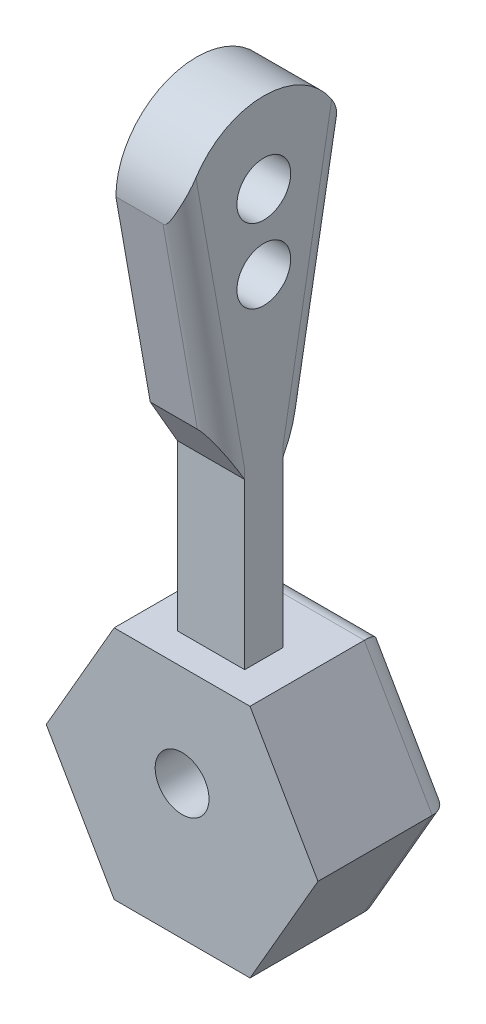
ISO-10303-21;
HEADER;
FILE_DESCRIPTION(('STEP AP214'),'2;1');
FILE_NAME('part.step','',(''),(''),'','','');
FILE_SCHEMA(('AUTOMOTIVE_DESIGN { 1 0 10303 214 1 1 1 1 }'));
ENDSEC;
DATA;
#1=APPLICATION_CONTEXT('core data for automotive mechanical design processes');
#2=APPLICATION_PROTOCOL_DEFINITION('international standard','automotive_design',2000,#1);
#3=PRODUCT_CONTEXT('',#1,'mechanical');
#4=PRODUCT('Part','Part','',(#3));
#5=PRODUCT_RELATED_PRODUCT_CATEGORY('part','',(#4));
#6=PRODUCT_DEFINITION_FORMATION('','',#4);
#7=PRODUCT_DEFINITION_CONTEXT('part definition',#1,'design');
#8=PRODUCT_DEFINITION('design','',#6,#7);
#9=PRODUCT_DEFINITION_SHAPE('','',#8);
#10=(LENGTH_UNIT() NAMED_UNIT(*) SI_UNIT(.MILLI.,.METRE.));
#11=(NAMED_UNIT(*) PLANE_ANGLE_UNIT() SI_UNIT($,.RADIAN.));
#12=(NAMED_UNIT(*) SI_UNIT($,.STERADIAN.) SOLID_ANGLE_UNIT());
#13=UNCERTAINTY_MEASURE_WITH_UNIT(LENGTH_MEASURE(1.E-05),#10,'distance_accuracy_value','');
#14=(GEOMETRIC_REPRESENTATION_CONTEXT(3) GLOBAL_UNCERTAINTY_ASSIGNED_CONTEXT((#13)) GLOBAL_UNIT_ASSIGNED_CONTEXT((#10,
#11,#12)) REPRESENTATION_CONTEXT('',''));
#15=CARTESIAN_POINT('',(0.,0.,0.));
#16=DIRECTION('',(0.,0.,1.));
#17=DIRECTION('',(1.,0.,0.));
#18=AXIS2_PLACEMENT_3D('',#15,#16,#17);
#19=CARTESIAN_POINT('',(-20.2072594216369,0.,-20.));
#20=DIRECTION('',(-0.866025403784439,-0.5,0.));
#21=DIRECTION('',(0.5,-0.866025403784439,0.));
#22=AXIS2_PLACEMENT_3D('',#19,#20,#21);
#23=PLANE('',#22);
#24=DIRECTION('',(0.,0.,1.));
#25=VECTOR('',#24,1.);
#26=CARTESIAN_POINT('',(-20.2072594216369,0.,-20.));
#27=LINE('',#26,#25);
#28=CARTESIAN_POINT('',(-20.2072594216369,0.,-17.));
#29=VERTEX_POINT('',#28);
#30=CARTESIAN_POINT('',(-20.2072594216369,0.,0.));
#31=VERTEX_POINT('',#30);
#32=EDGE_CURVE('E263',#29,#31,#27,.T.);
#33=ORIENTED_EDGE('',*,*,#32,.F.);
#34=DIRECTION('',(0.5,-0.866025403784439,0.));
#35=VECTOR('',#34,1.);
#36=CARTESIAN_POINT('',(-10.1036297108184,-17.5,-17.));
#37=LINE('',#36,#35);
#38=CARTESIAN_POINT('',(-10.1036297108185,-17.5,-17.));
#39=VERTEX_POINT('',#38);
#40=EDGE_CURVE('E290',#29,#39,#37,.T.);
#41=ORIENTED_EDGE('',*,*,#40,.T.);
#42=DIRECTION('',(0.,0.,1.));
#43=VECTOR('',#42,1.);
#44=CARTESIAN_POINT('',(-10.1036297108185,-17.5,-20.));
#45=LINE('',#44,#43);
#46=CARTESIAN_POINT('',(-10.1036297108185,-17.5,0.));
#47=VERTEX_POINT('',#46);
#48=EDGE_CURVE('E262',#39,#47,#45,.T.);
#49=ORIENTED_EDGE('',*,*,#48,.T.);
#50=DIRECTION('',(0.5,-0.866025403784439,0.));
#51=VECTOR('',#50,1.);
#52=CARTESIAN_POINT('',(-20.2072594216369,0.,0.));
#53=LINE('',#52,#51);
#54=EDGE_CURVE('E243',#31,#47,#53,.T.);
#55=ORIENTED_EDGE('',*,*,#54,.F.);
#56=EDGE_LOOP('',(#33,#41,#49,#55));
#57=FACE_BOUND('',#56,.T.);
#58=ADVANCED_FACE('F33',(#57),#23,.T.);
#59=CARTESIAN_POINT('',(-10.1036297108184,17.5,-20.));
#60=DIRECTION('',(-0.866025403784438,0.5,0.));
#61=DIRECTION('',(-0.5,-0.866025403784438,0.));
#62=AXIS2_PLACEMENT_3D('',#59,#60,#61);
#63=PLANE('',#62);
#64=DIRECTION('',(0.,0.,1.));
#65=VECTOR('',#64,1.);
#66=CARTESIAN_POINT('',(-10.1036297108184,17.5,-20.));
#67=LINE('',#66,#65);
#68=CARTESIAN_POINT('',(-10.1036297108184,17.5,-17.));
#69=VERTEX_POINT('',#68);
#70=CARTESIAN_POINT('',(-10.1036297108184,17.5,0.));
#71=VERTEX_POINT('',#70);
#72=EDGE_CURVE('E266',#69,#71,#67,.T.);
#73=ORIENTED_EDGE('',*,*,#72,.F.);
#74=DIRECTION('',(-0.5,-0.866025403784438,0.));
#75=VECTOR('',#74,1.);
#76=CARTESIAN_POINT('',(-20.2072594216369,0.,-17.));
#77=LINE('',#76,#75);
#78=EDGE_CURVE('E265',#69,#29,#77,.T.);
#79=ORIENTED_EDGE('',*,*,#78,.T.);
#80=ORIENTED_EDGE('',*,*,#32,.T.);
#81=DIRECTION('',(-0.5,-0.866025403784438,0.));
#82=VECTOR('',#81,1.);
#83=CARTESIAN_POINT('',(-10.1036297108184,17.5,0.));
#84=LINE('',#83,#82);
#85=EDGE_CURVE('E259',#71,#31,#84,.T.);
#86=ORIENTED_EDGE('',*,*,#85,.F.);
#87=EDGE_LOOP('',(#73,#79,#80,#86));
#88=FACE_BOUND('',#87,.T.);
#89=ADVANCED_FACE('F372',(#88),#63,.T.);
#90=CARTESIAN_POINT('',(10.1036297108184,17.5,-20.));
#91=DIRECTION('',(0.,1.,0.));
#92=DIRECTION('',(0.,0.,1.));
#93=AXIS2_PLACEMENT_3D('',#90,#91,#92);
#94=PLANE('',#93);
#95=DIRECTION('',(0.,0.,-1.));
#96=VECTOR('',#95,1.);
#97=CARTESIAN_POINT('',(5.,17.5,0.));
#98=LINE('',#97,#96);
#99=CARTESIAN_POINT('',(5.,17.5,-4.30986864974605));
#100=VERTEX_POINT('',#99);
#101=CARTESIAN_POINT('',(5.,17.5,-10.));
#102=VERTEX_POINT('',#101);
#103=EDGE_CURVE('E168',#100,#102,#98,.T.);
#104=ORIENTED_EDGE('',*,*,#103,.F.);
#105=DIRECTION('',(-1.,0.,0.));
#106=VECTOR('',#105,1.);
#107=CARTESIAN_POINT('',(5.,17.5,-4.30986864974605));
#108=LINE('',#107,#106);
#109=CARTESIAN_POINT('',(-5.,17.5,-4.30986864974605));
#110=VERTEX_POINT('',#109);
#111=EDGE_CURVE('E177',#100,#110,#108,.T.);
#112=ORIENTED_EDGE('',*,*,#111,.T.);
#113=DIRECTION('',(0.,0.,-1.));
#114=VECTOR('',#113,1.);
#115=CARTESIAN_POINT('',(-5.,17.5,0.));
#116=LINE('',#115,#114);
#117=CARTESIAN_POINT('',(-5.,17.5,-10.));
#118=VERTEX_POINT('',#117);
#119=EDGE_CURVE('E204',#110,#118,#116,.T.);
#120=ORIENTED_EDGE('',*,*,#119,.T.);
#121=DIRECTION('',(-1.,0.,0.));
#122=VECTOR('',#121,1.);
#123=CARTESIAN_POINT('',(5.,17.5,-10.));
#124=LINE('',#123,#122);
#125=EDGE_CURVE('E184',#102,#118,#124,.T.);
#126=ORIENTED_EDGE('',*,*,#125,.F.);
#127=EDGE_LOOP('',(#104,#112,#120,#126));
#128=FACE_BOUND('',#127,.T.);
#129=DIRECTION('',(0.,0.,1.));
#130=VECTOR('',#129,1.);
#131=CARTESIAN_POINT('',(10.1036297108184,17.5,-20.));
#132=LINE('',#131,#130);
#133=CARTESIAN_POINT('',(10.1036297108184,17.5,-17.));
#134=VERTEX_POINT('',#133);
#135=CARTESIAN_POINT('',(10.1036297108184,17.5,0.));
#136=VERTEX_POINT('',#135);
#137=EDGE_CURVE('E268',#134,#136,#132,.T.);
#138=ORIENTED_EDGE('',*,*,#137,.F.);
#139=DIRECTION('',(-1.,0.,0.));
#140=VECTOR('',#139,1.);
#141=CARTESIAN_POINT('',(-10.1036297108184,17.5,-17.));
#142=LINE('',#141,#140);
#143=EDGE_CURVE('E298',#134,#69,#142,.T.);
#144=ORIENTED_EDGE('',*,*,#143,.T.);
#145=ORIENTED_EDGE('',*,*,#72,.T.);
#146=DIRECTION('',(-1.,0.,0.));
#147=VECTOR('',#146,1.);
#148=CARTESIAN_POINT('',(10.1036297108184,17.5,0.));
#149=LINE('',#148,#147);
#150=EDGE_CURVE('E256',#136,#71,#149,.T.);
#151=ORIENTED_EDGE('',*,*,#150,.F.);
#152=EDGE_LOOP('',(#138,#144,#145,#151));
#153=FACE_BOUND('',#152,.T.);
#154=ADVANCED_FACE('F187',(#128,#153),#94,.T.);
#155=CARTESIAN_POINT('',(20.2072594216369,0.,-20.));
#156=DIRECTION('',(0.866025403784438,0.500000000000001,0.));
#157=DIRECTION('',(-0.500000000000001,0.866025403784438,0.));
#158=AXIS2_PLACEMENT_3D('',#155,#156,#157);
#159=PLANE('',#158);
#160=DIRECTION('',(0.,0.,1.));
#161=VECTOR('',#160,1.);
#162=CARTESIAN_POINT('',(20.2072594216369,0.,-20.));
#163=LINE('',#162,#161);
#164=CARTESIAN_POINT('',(20.2072594216369,0.,-17.));
#165=VERTEX_POINT('',#164);
#166=CARTESIAN_POINT('',(20.2072594216369,0.,0.));
#167=VERTEX_POINT('',#166);
#168=EDGE_CURVE('E270',#165,#167,#163,.T.);
#169=ORIENTED_EDGE('',*,*,#168,.F.);
#170=DIRECTION('',(-0.500000000000001,0.866025403784438,0.));
#171=VECTOR('',#170,1.);
#172=CARTESIAN_POINT('',(10.1036297108184,17.5,-17.));
#173=LINE('',#172,#171);
#174=EDGE_CURVE('E296',#165,#134,#173,.T.);
#175=ORIENTED_EDGE('',*,*,#174,.T.);
#176=ORIENTED_EDGE('',*,*,#137,.T.);
#177=DIRECTION('',(-0.500000000000001,0.866025403784438,0.));
#178=VECTOR('',#177,1.);
#179=CARTESIAN_POINT('',(20.2072594216369,0.,0.));
#180=LINE('',#179,#178);
#181=EDGE_CURVE('E253',#167,#136,#180,.T.);
#182=ORIENTED_EDGE('',*,*,#181,.F.);
#183=EDGE_LOOP('',(#169,#175,#176,#182));
#184=FACE_BOUND('',#183,.T.);
#185=ADVANCED_FACE('F378',(#184),#159,.T.);
#186=CARTESIAN_POINT('',(10.1036297108184,-17.5,-20.));
#187=DIRECTION('',(0.866025403784438,-0.500000000000001,0.));
#188=DIRECTION('',(0.500000000000001,0.866025403784438,0.));
#189=AXIS2_PLACEMENT_3D('',#186,#187,#188);
#190=PLANE('',#189);
#191=DIRECTION('',(0.,0.,1.));
#192=VECTOR('',#191,1.);
#193=CARTESIAN_POINT('',(10.1036297108184,-17.5,-20.));
#194=LINE('',#193,#192);
#195=CARTESIAN_POINT('',(10.1036297108184,-17.5,-17.));
#196=VERTEX_POINT('',#195);
#197=CARTESIAN_POINT('',(10.1036297108184,-17.5,0.));
#198=VERTEX_POINT('',#197);
#199=EDGE_CURVE('E272',#196,#198,#194,.T.);
#200=ORIENTED_EDGE('',*,*,#199,.F.);
#201=DIRECTION('',(0.500000000000001,0.866025403784438,0.));
#202=VECTOR('',#201,1.);
#203=CARTESIAN_POINT('',(20.2072594216369,0.,-17.));
#204=LINE('',#203,#202);
#205=EDGE_CURVE('E294',#196,#165,#204,.T.);
#206=ORIENTED_EDGE('',*,*,#205,.T.);
#207=ORIENTED_EDGE('',*,*,#168,.T.);
#208=DIRECTION('',(0.500000000000001,0.866025403784438,0.));
#209=VECTOR('',#208,1.);
#210=CARTESIAN_POINT('',(10.1036297108184,-17.5,0.));
#211=LINE('',#210,#209);
#212=EDGE_CURVE('E250',#198,#167,#211,.T.);
#213=ORIENTED_EDGE('',*,*,#212,.F.);
#214=EDGE_LOOP('',(#200,#206,#207,#213));
#215=FACE_BOUND('',#214,.T.);
#216=ADVANCED_FACE('F381',(#215),#190,.T.);
#217=CARTESIAN_POINT('',(-10.1036297108185,-17.5,-20.));
#218=DIRECTION('',(0.,-1.,0.));
#219=DIRECTION('',(0.,0.,-1.));
#220=AXIS2_PLACEMENT_3D('',#217,#218,#219);
#221=PLANE('',#220);
#222=ORIENTED_EDGE('',*,*,#48,.F.);
#223=DIRECTION('',(1.,0.,0.));
#224=VECTOR('',#223,1.);
#225=CARTESIAN_POINT('',(10.1036297108184,-17.5,-17.));
#226=LINE('',#225,#224);
#227=EDGE_CURVE('E292',#39,#196,#226,.T.);
#228=ORIENTED_EDGE('',*,*,#227,.T.);
#229=ORIENTED_EDGE('',*,*,#199,.T.);
#230=DIRECTION('',(1.,0.,0.));
#231=VECTOR('',#230,1.);
#232=CARTESIAN_POINT('',(-10.1036297108185,-17.5,0.));
#233=LINE('',#232,#231);
#234=EDGE_CURVE('E247',#47,#198,#233,.T.);
#235=ORIENTED_EDGE('',*,*,#234,.F.);
#236=EDGE_LOOP('',(#222,#228,#229,#235));
#237=FACE_BOUND('',#236,.T.);
#238=ADVANCED_FACE('F367',(#237),#221,.T.);
#239=CARTESIAN_POINT('',(0.,0.,-20.));
#240=DIRECTION('',(0.,0.,1.));
#241=DIRECTION('',(1.,0.,0.));
#242=AXIS2_PLACEMENT_3D('',#239,#240,#241);
#243=PLANE('',#242);
#244=CARTESIAN_POINT('',(0.,2.5,-20.));
#245=DIRECTION('',(0.,0.,1.));
#246=DIRECTION('',(1.,0.,0.));
#247=AXIS2_PLACEMENT_3D('',#244,#245,#246);
#248=CIRCLE('',#247,7.);
#249=CARTESIAN_POINT('',(7.,2.5,-20.));
#250=VERTEX_POINT('',#249);
#251=EDGE_CURVE('E41',#250,#250,#248,.T.);
#252=ORIENTED_EDGE('',*,*,#251,.T.);
#253=EDGE_LOOP('',(#252));
#254=FACE_BOUND('',#253,.T.);
#255=DIRECTION('',(0.5,-0.866025403784439,0.));
#256=VECTOR('',#255,1.);
#257=CARTESIAN_POINT('',(-17.6091832102836,1.5,-20.));
#258=LINE('',#257,#256);
#259=CARTESIAN_POINT('',(-8.37157890324958,-14.5,-20.));
#260=VERTEX_POINT('',#259);
#261=CARTESIAN_POINT('',(-16.7431578064992,0.,-20.));
#262=VERTEX_POINT('',#261);
#263=EDGE_CURVE('E285',#260,#262,#258,.F.);
#264=ORIENTED_EDGE('',*,*,#263,.T.);
#265=DIRECTION('',(-0.5,-0.866025403784438,0.));
#266=VECTOR('',#265,1.);
#267=CARTESIAN_POINT('',(-7.50555349946513,16.,-20.));
#268=LINE('',#267,#266);
#269=CARTESIAN_POINT('',(-8.37157890324957,14.5,-20.));
#270=VERTEX_POINT('',#269);
#271=EDGE_CURVE('E287',#262,#270,#268,.F.);
#272=ORIENTED_EDGE('',*,*,#271,.T.);
#273=DIRECTION('',(-1.,0.,0.));
#274=VECTOR('',#273,1.);
#275=CARTESIAN_POINT('',(10.1036297108184,14.5,-20.));
#276=LINE('',#275,#274);
#277=CARTESIAN_POINT('',(8.37157890324957,14.5,-20.));
#278=VERTEX_POINT('',#277);
#279=EDGE_CURVE('E277',#270,#278,#276,.F.);
#280=ORIENTED_EDGE('',*,*,#279,.T.);
#281=DIRECTION('',(-0.500000000000001,0.866025403784438,0.));
#282=VECTOR('',#281,1.);
#283=CARTESIAN_POINT('',(17.6091832102836,-1.5,-20.));
#284=LINE('',#283,#282);
#285=CARTESIAN_POINT('',(16.7431578064992,0.,-20.));
#286=VERTEX_POINT('',#285);
#287=EDGE_CURVE('E279',#278,#286,#284,.F.);
#288=ORIENTED_EDGE('',*,*,#287,.T.);
#289=DIRECTION('',(0.500000000000001,0.866025403784438,0.));
#290=VECTOR('',#289,1.);
#291=CARTESIAN_POINT('',(7.50555349946513,-16.,-20.));
#292=LINE('',#291,#290);
#293=CARTESIAN_POINT('',(8.37157890324957,-14.5,-20.));
#294=VERTEX_POINT('',#293);
#295=EDGE_CURVE('E281',#286,#294,#292,.F.);
#296=ORIENTED_EDGE('',*,*,#295,.T.);
#297=DIRECTION('',(1.,0.,0.));
#298=VECTOR('',#297,1.);
#299=CARTESIAN_POINT('',(-10.1036297108185,-14.5,-20.));
#300=LINE('',#299,#298);
#301=EDGE_CURVE('E283',#294,#260,#300,.F.);
#302=ORIENTED_EDGE('',*,*,#301,.T.);
#303=EDGE_LOOP('',(#264,#272,#280,#288,#296,#302));
#304=FACE_BOUND('',#303,.T.);
#305=ADVANCED_FACE('F364',(#254,#304),#243,.F.);
#306=CARTESIAN_POINT('',(0.,0.,0.));
#307=DIRECTION('',(0.,0.,1.));
#308=DIRECTION('',(1.,0.,0.));
#309=AXIS2_PLACEMENT_3D('',#306,#307,#308);
#310=PLANE('',#309);
#311=CARTESIAN_POINT('',(0.,2.5,0.));
#312=DIRECTION('',(0.,0.,1.));
#313=DIRECTION('',(1.,0.,0.));
#314=AXIS2_PLACEMENT_3D('',#311,#312,#313);
#315=CIRCLE('',#314,4.);
#316=CARTESIAN_POINT('',(4.,2.5,0.));
#317=VERTEX_POINT('',#316);
#318=EDGE_CURVE('E240',#317,#317,#315,.T.);
#319=ORIENTED_EDGE('',*,*,#318,.F.);
#320=EDGE_LOOP('',(#319));
#321=FACE_BOUND('',#320,.T.);
#322=ORIENTED_EDGE('',*,*,#54,.T.);
#323=ORIENTED_EDGE('',*,*,#234,.T.);
#324=ORIENTED_EDGE('',*,*,#212,.T.);
#325=ORIENTED_EDGE('',*,*,#181,.T.);
#326=ORIENTED_EDGE('',*,*,#150,.T.);
#327=ORIENTED_EDGE('',*,*,#85,.T.);
#328=EDGE_LOOP('',(#322,#323,#324,#325,#326,#327));
#329=FACE_BOUND('',#328,.T.);
#330=ADVANCED_FACE('F362',(#321,#329),#310,.T.);
#331=CARTESIAN_POINT('',(0.,2.5,-20.));
#332=DIRECTION('',(0.,0.,1.));
#333=DIRECTION('',(1.,0.,0.));
#334=AXIS2_PLACEMENT_3D('',#331,#332,#333);
#335=CYLINDRICAL_SURFACE('',#334,4.);
#336=CARTESIAN_POINT('',(0.,2.5,-17.));
#337=DIRECTION('',(0.,0.,1.));
#338=DIRECTION('',(1.,0.,0.));
#339=AXIS2_PLACEMENT_3D('',#336,#337,#338);
#340=CIRCLE('',#339,4.);
#341=CARTESIAN_POINT('',(4.,2.5,-17.));
#342=VERTEX_POINT('',#341);
#343=EDGE_CURVE('E11',#342,#342,#340,.F.);
#344=ORIENTED_EDGE('',*,*,#343,.T.);
#345=EDGE_LOOP('',(#344));
#346=FACE_BOUND('',#345,.T.);
#347=ORIENTED_EDGE('',*,*,#318,.T.);
#348=EDGE_LOOP('',(#347));
#349=FACE_BOUND('',#348,.T.);
#350=ADVANCED_FACE('F358',(#346,#349),#335,.F.);
#351=CARTESIAN_POINT('',(7.50555349946513,-16.,-17.));
#352=DIRECTION('',(-0.500000000000001,-0.866025403784438,0.));
#353=DIRECTION('',(0.866025403784438,-0.500000000000001,0.));
#354=AXIS2_PLACEMENT_3D('',#351,#352,#353);
#355=CYLINDRICAL_SURFACE('',#354,3.);
#356=CARTESIAN_POINT('',(8.37157890324957,-14.5,-17.));
#357=DIRECTION('',(-0.866025403784439,-0.5,0.));
#358=DIRECTION('',(0.5,-0.866025403784439,0.));
#359=AXIS2_PLACEMENT_3D('',#356,#357,#358);
#360=ELLIPSE('',#359,3.46410161513775,3.);
#361=EDGE_CURVE('E309',#294,#196,#360,.T.);
#362=ORIENTED_EDGE('',*,*,#361,.F.);
#363=ORIENTED_EDGE('',*,*,#295,.F.);
#364=CARTESIAN_POINT('',(16.7431578064992,0.,-17.));
#365=DIRECTION('',(0.,-1.,0.));
#366=DIRECTION('',(1.,0.,0.));
#367=AXIS2_PLACEMENT_3D('',#364,#365,#366);
#368=ELLIPSE('',#367,3.46410161513776,3.);
#369=EDGE_CURVE('E244',#165,#286,#368,.F.);
#370=ORIENTED_EDGE('',*,*,#369,.F.);
#371=ORIENTED_EDGE('',*,*,#205,.F.);
#372=EDGE_LOOP('',(#362,#363,#370,#371));
#373=FACE_BOUND('',#372,.T.);
#374=ADVANCED_FACE('F361',(#373),#355,.T.);
#375=CARTESIAN_POINT('',(17.6091832102836,-1.5,-17.));
#376=DIRECTION('',(0.500000000000001,-0.866025403784438,0.));
#377=DIRECTION('',(0.866025403784438,0.500000000000001,0.));
#378=AXIS2_PLACEMENT_3D('',#375,#376,#377);
#379=CYLINDRICAL_SURFACE('',#378,3.);
#380=ORIENTED_EDGE('',*,*,#369,.T.);
#381=ORIENTED_EDGE('',*,*,#287,.F.);
#382=CARTESIAN_POINT('',(8.37157890324957,14.5,-17.));
#383=DIRECTION('',(0.866025403784439,-0.5,0.));
#384=DIRECTION('',(0.5,0.866025403784439,0.));
#385=AXIS2_PLACEMENT_3D('',#382,#383,#384);
#386=ELLIPSE('',#385,3.46410161513775,3.);
#387=EDGE_CURVE('E306',#134,#278,#386,.F.);
#388=ORIENTED_EDGE('',*,*,#387,.F.);
#389=ORIENTED_EDGE('',*,*,#174,.F.);
#390=EDGE_LOOP('',(#380,#381,#388,#389));
#391=FACE_BOUND('',#390,.T.);
#392=ADVANCED_FACE('F406',(#391),#379,.T.);
#393=CARTESIAN_POINT('',(-10.1036297108185,-14.5,-17.));
#394=DIRECTION('',(-1.,0.,0.));
#395=DIRECTION('',(0.,0.,1.));
#396=AXIS2_PLACEMENT_3D('',#393,#394,#395);
#397=CYLINDRICAL_SURFACE('',#396,3.);
#398=ORIENTED_EDGE('',*,*,#361,.T.);
#399=ORIENTED_EDGE('',*,*,#227,.F.);
#400=CARTESIAN_POINT('',(-8.37157890324958,-14.5,-17.));
#401=DIRECTION('',(-0.866025403784439,0.5,0.));
#402=DIRECTION('',(-0.5,-0.866025403784439,0.));
#403=AXIS2_PLACEMENT_3D('',#400,#401,#402);
#404=ELLIPSE('',#403,3.46410161513775,3.);
#405=EDGE_CURVE('E303',#260,#39,#404,.T.);
#406=ORIENTED_EDGE('',*,*,#405,.F.);
#407=ORIENTED_EDGE('',*,*,#301,.F.);
#408=EDGE_LOOP('',(#398,#399,#406,#407));
#409=FACE_BOUND('',#408,.T.);
#410=ADVANCED_FACE('F402',(#409),#397,.T.);
#411=CARTESIAN_POINT('',(10.1036297108184,14.5,-17.));
#412=DIRECTION('',(1.,0.,0.));
#413=DIRECTION('',(0.,0.,-1.));
#414=AXIS2_PLACEMENT_3D('',#411,#412,#413);
#415=CYLINDRICAL_SURFACE('',#414,3.);
#416=ORIENTED_EDGE('',*,*,#387,.T.);
#417=ORIENTED_EDGE('',*,*,#279,.F.);
#418=CARTESIAN_POINT('',(-8.37157890324957,14.5,-17.));
#419=DIRECTION('',(0.866025403784439,0.5,0.));
#420=DIRECTION('',(0.5,-0.866025403784439,0.));
#421=AXIS2_PLACEMENT_3D('',#418,#419,#420);
#422=ELLIPSE('',#421,3.46410161513775,3.);
#423=EDGE_CURVE('E301',#69,#270,#422,.F.);
#424=ORIENTED_EDGE('',*,*,#423,.F.);
#425=ORIENTED_EDGE('',*,*,#143,.F.);
#426=EDGE_LOOP('',(#416,#417,#424,#425));
#427=FACE_BOUND('',#426,.T.);
#428=ADVANCED_FACE('F398',(#427),#415,.T.);
#429=CARTESIAN_POINT('',(-17.6091832102836,1.5,-17.));
#430=DIRECTION('',(-0.5,0.866025403784439,0.));
#431=DIRECTION('',(-0.866025403784439,-0.5,0.));
#432=AXIS2_PLACEMENT_3D('',#429,#430,#431);
#433=CYLINDRICAL_SURFACE('',#432,3.);
#434=ORIENTED_EDGE('',*,*,#405,.T.);
#435=ORIENTED_EDGE('',*,*,#40,.F.);
#436=CARTESIAN_POINT('',(-16.7431578064992,0.,-17.));
#437=DIRECTION('',(0.,1.,0.));
#438=DIRECTION('',(-1.,0.,0.));
#439=AXIS2_PLACEMENT_3D('',#436,#437,#438);
#440=ELLIPSE('',#439,3.46410161513775,3.);
#441=EDGE_CURVE('E183',#262,#29,#440,.T.);
#442=ORIENTED_EDGE('',*,*,#441,.F.);
#443=ORIENTED_EDGE('',*,*,#263,.F.);
#444=EDGE_LOOP('',(#434,#435,#442,#443));
#445=FACE_BOUND('',#444,.T.);
#446=ADVANCED_FACE('F394',(#445),#433,.T.);
#447=CARTESIAN_POINT('',(-7.50555349946513,16.,-17.));
#448=DIRECTION('',(0.5,0.866025403784438,0.));
#449=DIRECTION('',(-0.866025403784438,0.5,0.));
#450=AXIS2_PLACEMENT_3D('',#447,#448,#449);
#451=CYLINDRICAL_SURFACE('',#450,3.);
#452=ORIENTED_EDGE('',*,*,#423,.T.);
#453=ORIENTED_EDGE('',*,*,#271,.F.);
#454=ORIENTED_EDGE('',*,*,#441,.T.);
#455=ORIENTED_EDGE('',*,*,#78,.F.);
#456=EDGE_LOOP('',(#452,#453,#454,#455));
#457=FACE_BOUND('',#456,.T.);
#458=ADVANCED_FACE('F357',(#457),#451,.T.);
#459=CARTESIAN_POINT('',(5.,0.,-4.30986864974605));
#460=DIRECTION('',(0.,0.,-1.));
#461=DIRECTION('',(-1.,0.,0.));
#462=AXIS2_PLACEMENT_3D('',#459,#460,#461);
#463=PLANE('',#462);
#464=DIRECTION('',(0.,-1.,0.));
#465=VECTOR('',#464,1.);
#466=CARTESIAN_POINT('',(-5.,0.,-4.30986864974605));
#467=LINE('',#466,#465);
#468=CARTESIAN_POINT('',(-5.,42.,-4.30986864974605));
#469=VERTEX_POINT('',#468);
#470=EDGE_CURVE('E180',#469,#110,#467,.T.);
#471=ORIENTED_EDGE('',*,*,#470,.T.);
#472=ORIENTED_EDGE('',*,*,#111,.F.);
#473=DIRECTION('',(0.,-1.,0.));
#474=VECTOR('',#473,1.);
#475=CARTESIAN_POINT('',(5.,0.,-4.30986864974605));
#476=LINE('',#475,#474);
#477=CARTESIAN_POINT('',(5.,43.3560988529845,-4.30986864974605));
#478=VERTEX_POINT('',#477);
#479=EDGE_CURVE('E163',#478,#100,#476,.T.);
#480=ORIENTED_EDGE('',*,*,#479,.F.);
#481=CARTESIAN_POINT('',(2.,43.3560988529845,-4.30986864974605));
#482=DIRECTION('',(0.,0.,-1.));
#483=DIRECTION('',(0.,1.,0.));
#484=AXIS2_PLACEMENT_3D('',#481,#482,#483);
#485=ELLIPSE('',#484,17.2763114494305,3.);
#486=CARTESIAN_POINT('',(4.99074359335779,42.,-4.30986864974605));
#487=VERTEX_POINT('',#486);
#488=EDGE_CURVE('E48',#478,#487,#485,.T.);
#489=ORIENTED_EDGE('',*,*,#488,.T.);
#490=DIRECTION('',(-1.,0.,0.));
#491=VECTOR('',#490,1.);
#492=CARTESIAN_POINT('',(5.,42.,-4.30986864974605));
#493=LINE('',#492,#491);
#494=EDGE_CURVE('E202',#487,#469,#493,.T.);
#495=ORIENTED_EDGE('',*,*,#494,.T.);
#496=EDGE_LOOP('',(#471,#472,#480,#489,#495));
#497=FACE_BOUND('',#496,.T.);
#498=ADVANCED_FACE('F178',(#497),#463,.F.);
#499=CARTESIAN_POINT('',(5.,0.,-10.));
#500=DIRECTION('',(0.,0.,-1.));
#501=DIRECTION('',(-1.,0.,0.));
#502=AXIS2_PLACEMENT_3D('',#499,#500,#501);
#503=PLANE('',#502);
#504=DIRECTION('',(0.,-1.,0.));
#505=VECTOR('',#504,1.);
#506=CARTESIAN_POINT('',(-5.,0.,-10.));
#507=LINE('',#506,#505);
#508=CARTESIAN_POINT('',(-5.,42.,-10.));
#509=VERTEX_POINT('',#508);
#510=EDGE_CURVE('E206',#509,#118,#507,.T.);
#511=ORIENTED_EDGE('',*,*,#510,.F.);
#512=DIRECTION('',(-1.,0.,0.));
#513=VECTOR('',#512,1.);
#514=CARTESIAN_POINT('',(5.,42.,-10.));
#515=LINE('',#514,#513);
#516=CARTESIAN_POINT('',(4.99074359335779,42.,-10.));
#517=VERTEX_POINT('',#516);
#518=EDGE_CURVE('E237',#517,#509,#515,.T.);
#519=ORIENTED_EDGE('',*,*,#518,.F.);
#520=CARTESIAN_POINT('',(2.,43.3560988529845,-10.));
#521=DIRECTION('',(0.,0.,-1.));
#522=DIRECTION('',(0.,-1.,0.));
#523=AXIS2_PLACEMENT_3D('',#520,#521,#522);
#524=ELLIPSE('',#523,17.2763114494305,3.);
#525=CARTESIAN_POINT('',(5.,43.3560988529845,-10.));
#526=VERTEX_POINT('',#525);
#527=EDGE_CURVE('E432',#517,#526,#524,.F.);
#528=ORIENTED_EDGE('',*,*,#527,.T.);
#529=DIRECTION('',(0.,-1.,0.));
#530=VECTOR('',#529,1.);
#531=CARTESIAN_POINT('',(5.,0.,-10.));
#532=LINE('',#531,#530);
#533=EDGE_CURVE('E190',#526,#102,#532,.T.);
#534=ORIENTED_EDGE('',*,*,#533,.T.);
#535=ORIENTED_EDGE('',*,*,#125,.T.);
#536=EDGE_LOOP('',(#511,#519,#528,#534,#535));
#537=FACE_BOUND('',#536,.T.);
#538=ADVANCED_FACE('F350',(#537),#503,.T.);
#539=CARTESIAN_POINT('',(5.,6.16987298107847,10.6865334794738));
#540=DIRECTION('',(0.,0.500000000000018,0.866025403784428));
#541=DIRECTION('',(0.,-0.866025403784428,0.500000000000018));
#542=AXIS2_PLACEMENT_3D('',#539,#540,#541);
#543=PLANE('',#542);
#544=DIRECTION('',(-1.,0.,0.));
#545=VECTOR('',#544,1.);
#546=CARTESIAN_POINT('',(5.,48.9999999999999,-14.0414518843275));
#547=LINE('',#546,#545);
#548=CARTESIAN_POINT('',(2.,48.9999999999999,-14.0414518843275));
#549=VERTEX_POINT('',#548);
#550=CARTESIAN_POINT('',(-5.,48.9999999999999,-14.0414518843275));
#551=VERTEX_POINT('',#550);
#552=EDGE_CURVE('E235',#549,#551,#547,.T.);
#553=ORIENTED_EDGE('',*,*,#552,.F.);
#554=CARTESIAN_POINT('',(2.,41.4037333412865,-9.65574528408295));
#555=DIRECTION('',(0.,0.500000000000018,0.866025403784428));
#556=DIRECTION('',(0.,-0.866025403784428,0.500000000000018));
#557=AXIS2_PLACEMENT_3D('',#554,#555,#556);
#558=ELLIPSE('',#557,8.77141320048885,3.);
#559=EDGE_CURVE('E428',#549,#517,#558,.F.);
#560=ORIENTED_EDGE('',*,*,#559,.T.);
#561=ORIENTED_EDGE('',*,*,#518,.T.);
#562=DIRECTION('',(0.,0.866025403784428,-0.500000000000018));
#563=VECTOR('',#562,1.);
#564=CARTESIAN_POINT('',(-5.,6.16987298107847,10.6865334794738));
#565=LINE('',#564,#563);
#566=EDGE_CURVE('E208',#509,#551,#565,.T.);
#567=ORIENTED_EDGE('',*,*,#566,.T.);
#568=EDGE_LOOP('',(#553,#560,#561,#567));
#569=FACE_BOUND('',#568,.T.);
#570=ADVANCED_FACE('F346',(#569),#543,.F.);
#571=CARTESIAN_POINT('',(5.,-0.923698902243836,-5.23855679109618));
#572=DIRECTION('',(0.,0.173648177666934,0.984807753012207));
#573=DIRECTION('',(0.,-0.984807753012207,0.173648177666934));
#574=AXIS2_PLACEMENT_3D('',#571,#572,#573);
#575=PLANE('',#574);
#576=DIRECTION('',(-1.,0.,0.));
#577=VECTOR('',#576,1.);
#578=CARTESIAN_POINT('',(5.,77.9999999999999,-19.1549343248731));
#579=LINE('',#578,#577);
#580=CARTESIAN_POINT('',(2.,77.9999999999999,-19.1549343248731));
#581=VERTEX_POINT('',#580);
#582=CARTESIAN_POINT('',(-5.,77.9999999999999,-19.1549343248731));
#583=VERTEX_POINT('',#582);
#584=EDGE_CURVE('E233',#581,#583,#579,.T.);
#585=ORIENTED_EDGE('',*,*,#584,.F.);
#586=DIRECTION('',(0.,0.984807753012207,-0.173648177666934));
#587=VECTOR('',#586,1.);
#588=CARTESIAN_POINT('',(2.,48.9999999999999,-14.0414518843275));
#589=LINE('',#588,#587);
#590=EDGE_CURVE('E429',#581,#549,#589,.F.);
#591=ORIENTED_EDGE('',*,*,#590,.T.);
#592=ORIENTED_EDGE('',*,*,#552,.T.);
#593=DIRECTION('',(0.,0.984807753012207,-0.173648177666934));
#594=VECTOR('',#593,1.);
#595=CARTESIAN_POINT('',(-5.,-0.923698902243836,-5.23855679109618));
#596=LINE('',#595,#594);
#597=EDGE_CURVE('E211',#551,#583,#596,.T.);
#598=ORIENTED_EDGE('',*,*,#597,.T.);
#599=EDGE_LOOP('',(#585,#591,#592,#598));
#600=FACE_BOUND('',#599,.T.);
#601=ADVANCED_FACE('F340',(#600),#575,.F.);
#602=CARTESIAN_POINT('',(5.,78.,-7.15493432487303));
#603=DIRECTION('',(-1.,0.,0.));
#604=DIRECTION('',(0.,0.,1.));
#605=AXIS2_PLACEMENT_3D('',#602,#603,#604);
#606=CYLINDRICAL_SURFACE('',#605,12.0000000000001);
#607=CARTESIAN_POINT('',(5.,78.,-7.15493432487303));
#608=DIRECTION('',(1.,0.,0.));
#609=DIRECTION('',(0.,0.,-1.));
#610=AXIS2_PLACEMENT_3D('',#607,#608,#609);
#611=CIRCLE('',#610,12.0000000000001);
#612=CARTESIAN_POINT('',(5.,84.4844745612218,-17.252042310077));
#613=VERTEX_POINT('',#612);
#614=CARTESIAN_POINT('',(5.,84.4844745612218,2.94217366033097));
#615=VERTEX_POINT('',#614);
#616=EDGE_CURVE('E192',#613,#615,#611,.T.);
#617=ORIENTED_EDGE('',*,*,#616,.F.);
#618=CARTESIAN_POINT('',(5.,84.4844745612218,-17.252042310077));
#619=CARTESIAN_POINT('',(4.99999654187455,84.4058631110676,-17.3025292157983));
#620=CARTESIAN_POINT('',(4.99799253091887,84.3266788841456,-17.3520834938529));
#621=CARTESIAN_POINT('',(4.99026496334026,84.1673299409103,-17.4492405332901));
#622=CARTESIAN_POINT('',(4.98454246610008,84.0871655102337,-17.4968438463903));
#623=CARTESIAN_POINT('',(4.96224590889318,83.845689207561,-17.6364625639893));
#624=CARTESIAN_POINT('',(4.94054060236838,83.6830933550702,-17.7254798732769));
#625=CARTESIAN_POINT('',(4.88549017881985,83.3561644650084,-17.8948272285606));
#626=CARTESIAN_POINT('',(4.85218528180876,83.1918393086119,-17.9751860520632));
#627=CARTESIAN_POINT('',(4.77551034486313,82.861578067133,-18.1275437933584));
#628=CARTESIAN_POINT('',(4.73213421424992,82.6956410656905,-18.1995376126414));
#629=CARTESIAN_POINT('',(4.61441285203392,82.2853219915426,-18.3667748931481));
#630=CARTESIAN_POINT('',(4.53505449361653,82.0404113742723,-18.4572230308863));
#631=CARTESIAN_POINT('',(4.36075125754457,81.550304808796,-18.6206281354058));
#632=CARTESIAN_POINT('',(4.26580042632446,81.3051087872619,-18.6935783948118));
#633=CARTESIAN_POINT('',(4.06212428393175,80.8155958688736,-18.8226896838697));
#634=CARTESIAN_POINT('',(3.9533805467922,80.5712806061028,-18.8788279107532));
#635=CARTESIAN_POINT('',(3.78033098682013,80.2072378110983,-18.9508413787907));
#636=CARTESIAN_POINT('',(3.72099485943701,80.0863002904527,-18.9728128849624));
#637=CARTESIAN_POINT('',(3.59879260675613,79.8455636673743,-19.0127911456327));
#638=CARTESIAN_POINT('',(3.53592692639824,79.7257644236651,-19.030798398468));
#639=CARTESIAN_POINT('',(3.40819740008913,79.4914524599193,-19.0624579159764));
#640=CARTESIAN_POINT('',(3.34345344149969,79.3768901050411,-19.0762265144284));
#641=CARTESIAN_POINT('',(3.20942566935966,79.1501229254755,-19.1002339568811));
#642=CARTESIAN_POINT('',(3.14014438535254,79.037916832493,-19.1104747480189));
#643=CARTESIAN_POINT('',(3.01863994729585,78.852837646155,-19.1248260450659));
#644=CARTESIAN_POINT('',(2.96810391262832,78.7789290941335,-19.1298487559046));
#645=CARTESIAN_POINT('',(2.86299322768445,78.6335257439847,-19.1384207432468));
#646=CARTESIAN_POINT('',(2.80840609333039,78.5620394873484,-19.1419652217083));
#647=CARTESIAN_POINT('',(2.69321928233188,78.4229000838609,-19.147684381033));
#648=CARTESIAN_POINT('',(2.63256856122951,78.3552886119496,-19.1498460595659));
#649=CARTESIAN_POINT('',(2.50273592464258,78.2286091023473,-19.1529187185062));
#650=CARTESIAN_POINT('',(2.43359967884664,78.1694987517195,-19.1538360995026));
#651=CARTESIAN_POINT('',(2.32677405253843,78.0996209218285,-19.1545394313855));
#652=CARTESIAN_POINT('',(2.29445011411618,78.0808448491657,-19.1546734334772));
#653=CARTESIAN_POINT('',(2.22753035569369,78.0481908477172,-19.1548483359472));
#654=CARTESIAN_POINT('',(2.19294724793275,78.0342879122681,-19.1548897176894));
#655=CARTESIAN_POINT('',(2.13200048079161,78.0160707850121,-19.1549261971142));
#656=CARTESIAN_POINT('',(2.10612393344184,78.0101501387916,-19.1549311649357));
#657=CARTESIAN_POINT('',(2.05352525952988,78.002065761293,-19.1549343711644));
#658=CARTESIAN_POINT('',(2.02679714609535,77.9999416372122,-19.1549325392334));
#659=CARTESIAN_POINT('',(1.99999999999999,78.,-19.1549343248731));
#660=B_SPLINE_CURVE_WITH_KNOTS('',3,(#618,#619,#620,#621,#622,#623,#624,#625,#626,#627,#628,
#629,#630,#631,#632,#633,#634,#635,#636,#637,#638,#639,#640,#641,#642,#643,#644,#645,#646,#647,
#648,#649,#650,#651,#652,#653,#654,#655,#656,#657,#658,#659),.UNSPECIFIED.,.F.,.F.,(4,2,2,2,2,2,
2,2,2,2,2,2,2,2,2,2,2,2,2,2,4),(0.,0.280217435270998,0.560355072629474,1.11956141023663,
1.67684776785579,2.234472031841,3.0518953606685,3.86963152937743,4.68847185163448,
5.09785740144456,5.50719145897284,5.90400839823968,6.30060596620239,6.56954983862066,
6.83935997926345,7.11167120712111,7.38257630203736,7.49444624060731,7.6057334083243,
7.68510492437656,7.76529975425433),.UNSPECIFIED.);
#661=EDGE_CURVE('E325',#613,#581,#660,.T.);
#662=ORIENTED_EDGE('',*,*,#661,.T.);
#663=ORIENTED_EDGE('',*,*,#584,.T.);
#664=CARTESIAN_POINT('',(-5.,78.,-7.15493432487303));
#665=DIRECTION('',(1.,0.,0.));
#666=DIRECTION('',(0.,0.,-1.));
#667=AXIS2_PLACEMENT_3D('',#664,#665,#666);
#668=CIRCLE('',#667,12.0000000000001);
#669=CARTESIAN_POINT('',(-5.,78.,4.84506567512709));
#670=VERTEX_POINT('',#669);
#671=EDGE_CURVE('E214',#583,#670,#668,.T.);
#672=ORIENTED_EDGE('',*,*,#671,.T.);
#673=DIRECTION('',(-1.,0.,0.));
#674=VECTOR('',#673,1.);
#675=CARTESIAN_POINT('',(5.,78.,4.84506567512709));
#676=LINE('',#675,#674);
#677=CARTESIAN_POINT('',(2.,78.,4.84506567512709));
#678=VERTEX_POINT('',#677);
#679=EDGE_CURVE('E231',#678,#670,#676,.T.);
#680=ORIENTED_EDGE('',*,*,#679,.F.);
#681=CARTESIAN_POINT('',(2.,78.,4.84506567512709));
#682=CARTESIAN_POINT('',(2.03420192981082,77.9998733457015,4.8450617724677));
#683=CARTESIAN_POINT('',(2.06820660970862,78.0033646909039,4.84506602498566));
#684=CARTESIAN_POINT('',(2.1344589017177,78.0163054157425,4.84505724908346));
#685=CARTESIAN_POINT('',(2.16672709543888,78.0256467392103,4.84504452944242));
#686=CARTESIAN_POINT('',(2.2416774369633,78.0536701169802,4.84495598213789));
#687=CARTESIAN_POINT('',(2.28350070641115,78.0745759479447,4.84485743265467));
#688=CARTESIAN_POINT('',(2.3637955476425,78.1224970987491,4.84446478630507));
#689=CARTESIAN_POINT('',(2.40223424333181,78.1495647630014,4.84416896950622));
#690=CARTESIAN_POINT('',(2.49094792114672,78.2192594051373,4.84313093907229));
#691=CARTESIAN_POINT('',(2.53972683110926,78.2637531158586,4.84225661871574));
#692=CARTESIAN_POINT('',(2.6329717572999,78.3570899330497,4.83984326281674));
#693=CARTESIAN_POINT('',(2.67742731514739,78.4059430638182,4.83830266221325));
#694=CARTESIAN_POINT('',(2.76332247258502,78.5065781766627,4.83447460223529));
#695=CARTESIAN_POINT('',(2.80474687587881,78.5583728734064,4.83218365828246));
#696=CARTESIAN_POINT('',(2.88508564266095,78.6637232593624,4.82681251761915));
#697=CARTESIAN_POINT('',(2.92400267776107,78.717276979258,4.82373317895525));
#698=CARTESIAN_POINT('',(3.03109345671124,78.8701582793743,4.81388273771169));
#699=CARTESIAN_POINT('',(3.09705640370531,78.9709701620506,4.80615625326036));
#700=CARTESIAN_POINT('',(3.22453886724954,79.1751320204705,4.78782929359093));
#701=CARTESIAN_POINT('',(3.28605622416339,79.27848319755,4.77722743326464));
#702=CARTESIAN_POINT('',(3.40566699980043,79.4870345135971,4.75303629524455));
#703=CARTESIAN_POINT('',(3.46375450135853,79.5922374635323,4.73944203566776));
#704=CARTESIAN_POINT('',(3.57691541346785,79.8038233500507,4.70919875766053));
#705=CARTESIAN_POINT('',(3.63198845773867,79.9102064281486,4.69254936907278));
#706=CARTESIAN_POINT('',(3.7931727683509,80.2307150857127,4.63789690303693));
#707=CARTESIAN_POINT('',(3.89520601763944,80.4461233347042,4.59519825749281));
#708=CARTESIAN_POINT('',(4.08878886360973,80.8784096059197,4.49684217978537));
#709=CARTESIAN_POINT('',(4.18034833944839,81.0952860353033,4.44119711192327));
#710=CARTESIAN_POINT('',(4.35256057460218,81.5302545912421,4.31627504287957));
#711=CARTESIAN_POINT('',(4.43318111887768,81.7483484200124,4.24695919174204));
#712=CARTESIAN_POINT('',(4.58163750034913,82.1841911395521,4.09432701083826));
#713=CARTESIAN_POINT('',(4.64946609988996,82.4019397663359,4.01100280529925));
#714=CARTESIAN_POINT('',(4.76957193215582,82.8345243771097,3.83060099801873));
#715=CARTESIAN_POINT('',(4.82193556089867,83.0493698872563,3.73360445503632));
#716=CARTESIAN_POINT('',(4.9084858742534,83.4757335051007,3.52553704504071));
#717=CARTESIAN_POINT('',(4.94269419496666,83.6872552805919,3.41448312698128));
#718=CARTESIAN_POINT('',(4.97688881205118,83.9954795700962,3.24060617691425));
#719=CARTESIAN_POINT('',(4.9854142006941,84.0942382476949,3.18302224180487));
#720=CARTESIAN_POINT('',(4.99696993401778,84.2904427184062,3.06482487237359));
#721=CARTESIAN_POINT('',(4.99999233249054,84.3878864116446,3.00420718685135));
#722=CARTESIAN_POINT('',(5.,84.4844745612218,2.94217366033097));
#723=B_SPLINE_CURVE_WITH_KNOTS('',3,(#681,#682,#683,#684,#685,#686,#687,#688,#689,#690,#691,
#692,#693,#694,#695,#696,#697,#698,#699,#700,#701,#702,#703,#704,#705,#706,#707,#708,#709,#710,
#711,#712,#713,#714,#715,#716,#717,#718,#719,#720,#721,#722),.UNSPECIFIED.,.F.,.F.,(4,2,2,2,2,2,
2,2,2,2,2,2,2,2,2,2,2,2,2,2,4),(0.,0.10211313540786,0.20239359970544,0.341867078108728,
0.482572778678162,0.680153740258093,0.878201352667041,1.07718205338499,1.27594710797316,
1.63789183206296,2.00001122054429,2.36273810405329,2.72550896435113,3.45131561040902,
4.17643190979219,4.90363935119252,5.63125701865084,6.35472938360443,7.0773376227124,
7.42109417802643,7.76534671847195),.UNSPECIFIED.);
#724=EDGE_CURVE('E318',#678,#615,#723,.T.);
#725=ORIENTED_EDGE('',*,*,#724,.T.);
#726=EDGE_LOOP('',(#617,#662,#663,#672,#680,#725));
#727=FACE_BOUND('',#726,.T.);
#728=ADVANCED_FACE('F334',(#727),#606,.T.);
#729=CARTESIAN_POINT('',(5.,1.52343276103503,-8.6398165210678));
#730=DIRECTION('',(0.,-0.173648177666934,0.984807753012208));
#731=DIRECTION('',(0.,-0.984807753012208,-0.173648177666934));
#732=AXIS2_PLACEMENT_3D('',#729,#730,#731);
#733=PLANE('',#732);
#734=DIRECTION('',(-1.,0.,0.));
#735=VECTOR('',#734,1.);
#736=CARTESIAN_POINT('',(5.,48.9999999999999,-0.26841676541851));
#737=LINE('',#736,#735);
#738=CARTESIAN_POINT('',(2.,48.9999999999999,-0.26841676541851));
#739=VERTEX_POINT('',#738);
#740=CARTESIAN_POINT('',(-5.,48.9999999999999,-0.26841676541851));
#741=VERTEX_POINT('',#740);
#742=EDGE_CURVE('E229',#739,#741,#737,.T.);
#743=ORIENTED_EDGE('',*,*,#742,.F.);
#744=DIRECTION('',(0.,0.984807753012208,0.173648177666934));
#745=VECTOR('',#744,1.);
#746=CARTESIAN_POINT('',(2.,1.52343276103503,-8.6398165210678));
#747=LINE('',#746,#745);
#748=EDGE_CURVE('E435',#739,#678,#747,.T.);
#749=ORIENTED_EDGE('',*,*,#748,.T.);
#750=ORIENTED_EDGE('',*,*,#679,.T.);
#751=DIRECTION('',(0.,0.984807753012208,0.173648177666934));
#752=VECTOR('',#751,1.);
#753=CARTESIAN_POINT('',(-5.,1.52343276103503,-8.6398165210678));
#754=LINE('',#753,#752);
#755=EDGE_CURVE('E217',#741,#670,#754,.T.);
#756=ORIENTED_EDGE('',*,*,#755,.F.);
#757=EDGE_LOOP('',(#743,#749,#750,#756));
#758=FACE_BOUND('',#757,.T.);
#759=ADVANCED_FACE('F339',(#758),#733,.T.);
#760=CARTESIAN_POINT('',(5.,66.99,-7.15493432487303));
#761=DIRECTION('',(-1.,0.,0.));
#762=DIRECTION('',(0.,0.,1.));
#763=AXIS2_PLACEMENT_3D('',#760,#761,#762);
#764=CYLINDRICAL_SURFACE('',#763,4.);
#765=CARTESIAN_POINT('',(5.,66.99,-7.15493432487303));
#766=DIRECTION('',(1.,0.,0.));
#767=DIRECTION('',(0.,0.,-1.));
#768=AXIS2_PLACEMENT_3D('',#765,#766,#767);
#769=CIRCLE('',#768,4.);
#770=CARTESIAN_POINT('',(5.,66.99,-11.154934324873));
#771=VERTEX_POINT('',#770);
#772=EDGE_CURVE('E196',#771,#771,#769,.T.);
#773=ORIENTED_EDGE('',*,*,#772,.T.);
#774=EDGE_LOOP('',(#773));
#775=FACE_BOUND('',#774,.T.);
#776=CARTESIAN_POINT('',(-5.,66.99,-7.15493432487303));
#777=DIRECTION('',(1.,0.,0.));
#778=DIRECTION('',(0.,0.,-1.));
#779=AXIS2_PLACEMENT_3D('',#776,#777,#778);
#780=CIRCLE('',#779,4.);
#781=CARTESIAN_POINT('',(-5.,66.99,-11.154934324873));
#782=VERTEX_POINT('',#781);
#783=EDGE_CURVE('E223',#782,#782,#780,.T.);
#784=ORIENTED_EDGE('',*,*,#783,.F.);
#785=EDGE_LOOP('',(#784));
#786=FACE_BOUND('',#785,.T.);
#787=ADVANCED_FACE('F562',(#775,#786),#764,.F.);
#788=CARTESIAN_POINT('',(5.,12.3662278688279,-21.4189349667831));
#789=DIRECTION('',(0.,-0.500000000000018,0.866025403784428));
#790=DIRECTION('',(0.,-0.866025403784428,-0.500000000000018));
#791=AXIS2_PLACEMENT_3D('',#788,#789,#790);
#792=PLANE('',#791);
#793=ORIENTED_EDGE('',*,*,#494,.F.);
#794=CARTESIAN_POINT('',(2.,41.4037333412865,-4.6541233656631));
#795=DIRECTION('',(0.,-0.500000000000018,0.866025403784428));
#796=DIRECTION('',(0.,0.866025403784428,0.500000000000018));
#797=AXIS2_PLACEMENT_3D('',#794,#795,#796);
#798=ELLIPSE('',#797,8.77141320048884,3.);
#799=EDGE_CURVE('E55',#487,#739,#798,.T.);
#800=ORIENTED_EDGE('',*,*,#799,.T.);
#801=ORIENTED_EDGE('',*,*,#742,.T.);
#802=DIRECTION('',(0.,0.866025403784428,0.500000000000018));
#803=VECTOR('',#802,1.);
#804=CARTESIAN_POINT('',(-5.,12.3662278688279,-21.4189349667831));
#805=LINE('',#804,#803);
#806=EDGE_CURVE('E220',#469,#741,#805,.T.);
#807=ORIENTED_EDGE('',*,*,#806,.F.);
#808=EDGE_LOOP('',(#793,#800,#801,#807));
#809=FACE_BOUND('',#808,.T.);
#810=ADVANCED_FACE('F570',(#809),#792,.T.);
#811=CARTESIAN_POINT('',(5.,78.,-7.15493432487303));
#812=DIRECTION('',(-1.,0.,0.));
#813=DIRECTION('',(0.,0.,1.));
#814=AXIS2_PLACEMENT_3D('',#811,#812,#813);
#815=CYLINDRICAL_SURFACE('',#814,4.);
#816=CARTESIAN_POINT('',(5.,78.,-7.15493432487303));
#817=DIRECTION('',(1.,0.,0.));
#818=DIRECTION('',(0.,0.,-1.));
#819=AXIS2_PLACEMENT_3D('',#816,#817,#818);
#820=CIRCLE('',#819,4.);
#821=CARTESIAN_POINT('',(5.,78.,-11.154934324873));
#822=VERTEX_POINT('',#821);
#823=EDGE_CURVE('E199',#822,#822,#820,.T.);
#824=ORIENTED_EDGE('',*,*,#823,.T.);
#825=EDGE_LOOP('',(#824));
#826=FACE_BOUND('',#825,.T.);
#827=CARTESIAN_POINT('',(-5.,78.,-7.15493432487303));
#828=DIRECTION('',(1.,0.,0.));
#829=DIRECTION('',(0.,0.,-1.));
#830=AXIS2_PLACEMENT_3D('',#827,#828,#829);
#831=CIRCLE('',#830,4.);
#832=CARTESIAN_POINT('',(-5.,78.,-11.154934324873));
#833=VERTEX_POINT('',#832);
#834=EDGE_CURVE('E173',#833,#833,#831,.T.);
#835=ORIENTED_EDGE('',*,*,#834,.F.);
#836=EDGE_LOOP('',(#835));
#837=FACE_BOUND('',#836,.T.);
#838=ADVANCED_FACE('F578',(#826,#837),#815,.F.);
#839=CARTESIAN_POINT('',(5.,0.,0.));
#840=DIRECTION('',(1.,0.,0.));
#841=DIRECTION('',(0.,0.,-1.));
#842=AXIS2_PLACEMENT_3D('',#839,#840,#841);
#843=PLANE('',#842);
#844=ORIENTED_EDGE('',*,*,#533,.F.);
#845=DIRECTION('',(0.,0.984807753012207,-0.173648177666934));
#846=VECTOR('',#845,1.);
#847=CARTESIAN_POINT('',(5.,78.5209445330007,-16.2005110658365));
#848=LINE('',#847,#846);
#849=EDGE_CURVE('E315',#526,#613,#848,.T.);
#850=ORIENTED_EDGE('',*,*,#849,.T.);
#851=ORIENTED_EDGE('',*,*,#616,.T.);
#852=DIRECTION('',(0.,0.984807753012208,0.173648177666934));
#853=VECTOR('',#852,1.);
#854=CARTESIAN_POINT('',(5.,2.04437729403583,-11.5942397801044));
#855=LINE('',#854,#853);
#856=EDGE_CURVE('E172',#615,#478,#855,.F.);
#857=ORIENTED_EDGE('',*,*,#856,.T.);
#858=ORIENTED_EDGE('',*,*,#479,.T.);
#859=ORIENTED_EDGE('',*,*,#103,.T.);
#860=EDGE_LOOP('',(#844,#850,#851,#857,#858,#859));
#861=FACE_BOUND('',#860,.T.);
#862=ORIENTED_EDGE('',*,*,#772,.F.);
#863=EDGE_LOOP('',(#862));
#864=FACE_BOUND('',#863,.T.);
#865=ORIENTED_EDGE('',*,*,#823,.F.);
#866=EDGE_LOOP('',(#865));
#867=FACE_BOUND('',#866,.T.);
#868=ADVANCED_FACE('F165',(#861,#864,#867),#843,.T.);
#869=CARTESIAN_POINT('',(-5.,0.,0.));
#870=DIRECTION('',(1.,0.,0.));
#871=DIRECTION('',(0.,0.,-1.));
#872=AXIS2_PLACEMENT_3D('',#869,#870,#871);
#873=PLANE('',#872);
#874=ORIENTED_EDGE('',*,*,#470,.F.);
#875=ORIENTED_EDGE('',*,*,#806,.T.);
#876=ORIENTED_EDGE('',*,*,#755,.T.);
#877=ORIENTED_EDGE('',*,*,#671,.F.);
#878=ORIENTED_EDGE('',*,*,#597,.F.);
#879=ORIENTED_EDGE('',*,*,#566,.F.);
#880=ORIENTED_EDGE('',*,*,#510,.T.);
#881=ORIENTED_EDGE('',*,*,#119,.F.);
#882=EDGE_LOOP('',(#874,#875,#876,#877,#878,#879,#880,#881));
#883=FACE_BOUND('',#882,.T.);
#884=ORIENTED_EDGE('',*,*,#783,.T.);
#885=EDGE_LOOP('',(#884));
#886=FACE_BOUND('',#885,.T.);
#887=ORIENTED_EDGE('',*,*,#834,.T.);
#888=EDGE_LOOP('',(#887));
#889=FACE_BOUND('',#888,.T.);
#890=ADVANCED_FACE('F416',(#883,#886,#889),#873,.F.);
#891=CARTESIAN_POINT('',(2.,-0.402754369243033,-2.28413353205956));
#892=DIRECTION('',(0.,-0.984807753012207,0.173648177666934));
#893=DIRECTION('',(0.,-0.173648177666934,-0.984807753012207));
#894=AXIS2_PLACEMENT_3D('',#891,#892,#893);
#895=CYLINDRICAL_SURFACE('',#894,3.);
#896=ORIENTED_EDGE('',*,*,#559,.F.);
#897=ORIENTED_EDGE('',*,*,#590,.F.);
#898=ORIENTED_EDGE('',*,*,#661,.F.);
#899=ORIENTED_EDGE('',*,*,#849,.F.);
#900=ORIENTED_EDGE('',*,*,#527,.F.);
#901=EDGE_LOOP('',(#896,#897,#898,#899,#900));
#902=FACE_BOUND('',#901,.T.);
#903=ADVANCED_FACE('F413',(#902),#895,.T.);
#904=CARTESIAN_POINT('',(2.,2.04437729403583,-11.5942397801044));
#905=DIRECTION('',(0.,0.984807753012208,0.173648177666934));
#906=DIRECTION('',(0.,-0.173648177666934,0.984807753012208));
#907=AXIS2_PLACEMENT_3D('',#904,#905,#906);
#908=CYLINDRICAL_SURFACE('',#907,3.);
#909=ORIENTED_EDGE('',*,*,#488,.F.);
#910=ORIENTED_EDGE('',*,*,#856,.F.);
#911=ORIENTED_EDGE('',*,*,#724,.F.);
#912=ORIENTED_EDGE('',*,*,#748,.F.);
#913=ORIENTED_EDGE('',*,*,#799,.F.);
#914=EDGE_LOOP('',(#909,#910,#911,#912,#913));
#915=FACE_BOUND('',#914,.T.);
#916=ADVANCED_FACE('F332',(#915),#908,.T.);
#917=CARTESIAN_POINT('',(0.,2.5,-17.));
#918=DIRECTION('',(0.,0.,1.));
#919=DIRECTION('',(1.,0.,0.));
#920=AXIS2_PLACEMENT_3D('',#917,#918,#919);
#921=TOROIDAL_SURFACE('',#920,7.,3.);
#922=ORIENTED_EDGE('',*,*,#343,.F.);
#923=EDGE_LOOP('',(#922));
#924=FACE_BOUND('',#923,.T.);
#925=ORIENTED_EDGE('',*,*,#251,.F.);
#926=EDGE_LOOP('',(#925));
#927=FACE_BOUND('',#926,.T.);
#928=ADVANCED_FACE('F35',(#924,#927),#921,.T.);
#929=CLOSED_SHELL('',(#58,#89,#154,#185,#216,#238,#305,#330,#350,#374,#392,#410,#428,#446,#458,
#498,#538,#570,#601,#728,#759,#787,#810,#838,#868,#890,#903,#916,#928));
#930=MANIFOLD_SOLID_BREP('B2',#929);
#931=ADVANCED_BREP_SHAPE_REPRESENTATION('',(#18,#930),#14);
#932=SHAPE_DEFINITION_REPRESENTATION(#9,#931);
ENDSEC;
END-ISO-10303-21;
